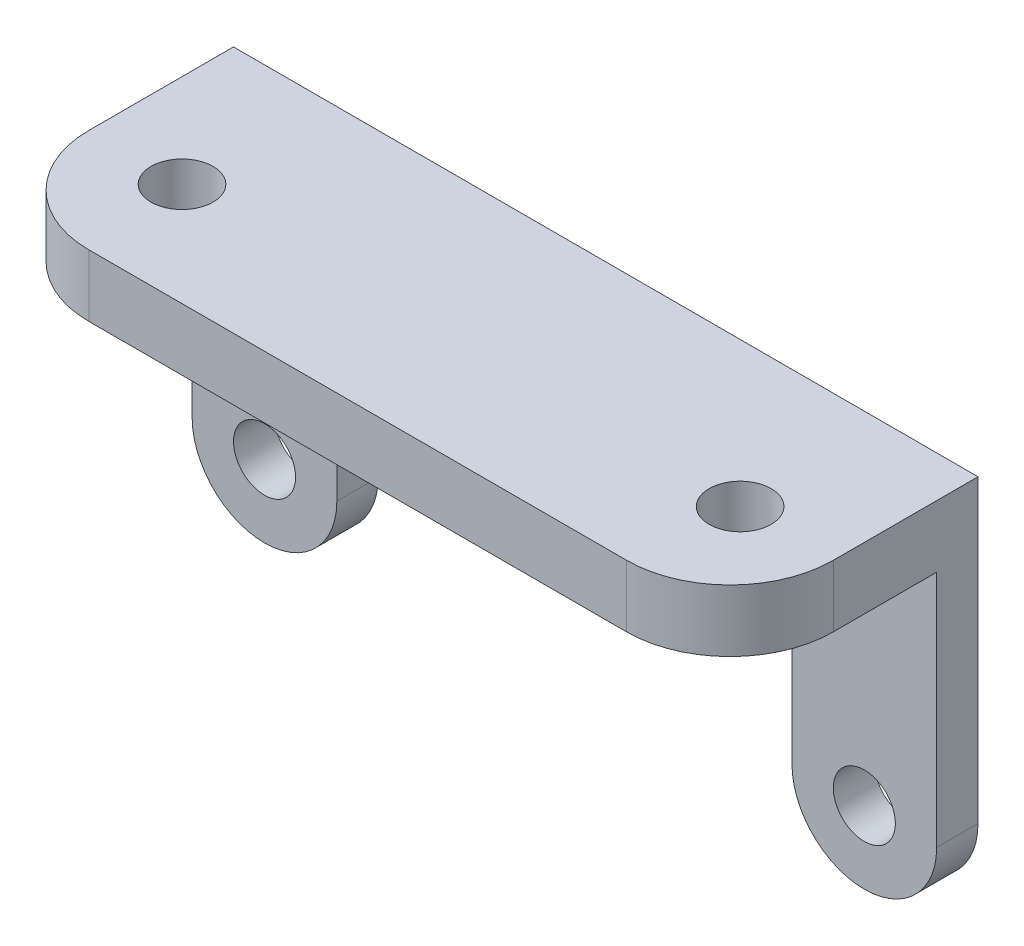
ISO-10303-21;
HEADER;
FILE_DESCRIPTION(('STEP AP214'),'2;1');
FILE_NAME('part.step','',(''),(''),'','','');
FILE_SCHEMA(('AUTOMOTIVE_DESIGN { 1 0 10303 214 1 1 1 1 }'));
ENDSEC;
DATA;
#1=APPLICATION_CONTEXT('core data for automotive mechanical design processes');
#2=APPLICATION_PROTOCOL_DEFINITION('international standard','automotive_design',2000,#1);
#3=PRODUCT_CONTEXT('',#1,'mechanical');
#4=PRODUCT('Part','Part','',(#3));
#5=PRODUCT_RELATED_PRODUCT_CATEGORY('part','',(#4));
#6=PRODUCT_DEFINITION_FORMATION('','',#4);
#7=PRODUCT_DEFINITION_CONTEXT('part definition',#1,'design');
#8=PRODUCT_DEFINITION('design','',#6,#7);
#9=PRODUCT_DEFINITION_SHAPE('','',#8);
#10=(LENGTH_UNIT() NAMED_UNIT(*) SI_UNIT(.MILLI.,.METRE.));
#11=(NAMED_UNIT(*) PLANE_ANGLE_UNIT() SI_UNIT($,.RADIAN.));
#12=(NAMED_UNIT(*) SI_UNIT($,.STERADIAN.) SOLID_ANGLE_UNIT());
#13=UNCERTAINTY_MEASURE_WITH_UNIT(LENGTH_MEASURE(1.E-05),#10,'distance_accuracy_value','');
#14=(GEOMETRIC_REPRESENTATION_CONTEXT(3) GLOBAL_UNCERTAINTY_ASSIGNED_CONTEXT((#13)) GLOBAL_UNIT_ASSIGNED_CONTEXT((#10,
#11,#12)) REPRESENTATION_CONTEXT('',''));
#15=CARTESIAN_POINT('',(0.,0.,0.));
#16=DIRECTION('',(0.,0.,1.));
#17=DIRECTION('',(1.,0.,0.));
#18=AXIS2_PLACEMENT_3D('',#15,#16,#17);
#19=CARTESIAN_POINT('',(-14.5085,-12.0321268610724,2.));
#20=DIRECTION('',(0.,0.,1.));
#21=DIRECTION('',(1.,0.,0.));
#22=AXIS2_PLACEMENT_3D('',#19,#20,#21);
#23=PLANE('',#22);
#24=DIRECTION('',(1.,0.,0.));
#25=VECTOR('',#24,1.);
#26=CARTESIAN_POINT('',(-18.0085,-0.499999999999994,2.));
#27=LINE('',#26,#25);
#28=CARTESIAN_POINT('',(-18.0085,-0.499999999999995,2.));
#29=VERTEX_POINT('',#28);
#30=CARTESIAN_POINT('',(18.0085,-0.499999999999995,2.));
#31=VERTEX_POINT('',#30);
#32=EDGE_CURVE('E141',#29,#31,#27,.T.);
#33=ORIENTED_EDGE('',*,*,#32,.F.);
#34=DIRECTION('',(0.,-1.,0.));
#35=VECTOR('',#34,1.);
#36=CARTESIAN_POINT('',(-18.0085,2.50000000000001,2.));
#37=LINE('',#36,#35);
#38=CARTESIAN_POINT('',(-18.0085,-12.0321268610724,2.));
#39=VERTEX_POINT('',#38);
#40=EDGE_CURVE('E146',#29,#39,#37,.T.);
#41=ORIENTED_EDGE('',*,*,#40,.T.);
#42=CARTESIAN_POINT('',(-14.5085,-12.0321268610724,2.));
#43=DIRECTION('',(0.,0.,1.));
#44=DIRECTION('',(1.,0.,0.));
#45=AXIS2_PLACEMENT_3D('',#42,#43,#44);
#46=CIRCLE('',#45,3.49999999999999);
#47=CARTESIAN_POINT('',(-11.0085,-12.0321268610724,2.));
#48=VERTEX_POINT('',#47);
#49=EDGE_CURVE('E175',#39,#48,#46,.T.);
#50=ORIENTED_EDGE('',*,*,#49,.T.);
#51=DIRECTION('',(0.,1.,0.));
#52=VECTOR('',#51,1.);
#53=CARTESIAN_POINT('',(-11.0085,-3.59582648567477,2.));
#54=LINE('',#53,#52);
#55=CARTESIAN_POINT('',(-11.0085,-3.59582648567477,2.));
#56=VERTEX_POINT('',#55);
#57=EDGE_CURVE('E177',#48,#56,#54,.T.);
#58=ORIENTED_EDGE('',*,*,#57,.T.);
#59=DIRECTION('',(1.,0.,0.));
#60=VECTOR('',#59,1.);
#61=CARTESIAN_POINT('',(-11.0085,-3.59582648567477,2.));
#62=LINE('',#61,#60);
#63=CARTESIAN_POINT('',(11.0085,-3.59582648567477,2.));
#64=VERTEX_POINT('',#63);
#65=EDGE_CURVE('E179',#56,#64,#62,.T.);
#66=ORIENTED_EDGE('',*,*,#65,.T.);
#67=DIRECTION('',(0.,-1.,0.));
#68=VECTOR('',#67,1.);
#69=CARTESIAN_POINT('',(11.0085,-3.59582648567477,2.));
#70=LINE('',#69,#68);
#71=CARTESIAN_POINT('',(11.0085,-12.0321268610723,2.));
#72=VERTEX_POINT('',#71);
#73=EDGE_CURVE('E181',#64,#72,#70,.T.);
#74=ORIENTED_EDGE('',*,*,#73,.T.);
#75=CARTESIAN_POINT('',(14.5085,-12.0321268610724,2.));
#76=DIRECTION('',(0.,0.,1.));
#77=DIRECTION('',(-1.,0.,0.));
#78=AXIS2_PLACEMENT_3D('',#75,#76,#77);
#79=CIRCLE('',#78,3.49999999999999);
#80=CARTESIAN_POINT('',(18.0085,-12.0321268610723,2.));
#81=VERTEX_POINT('',#80);
#82=EDGE_CURVE('E144',#72,#81,#79,.T.);
#83=ORIENTED_EDGE('',*,*,#82,.T.);
#84=DIRECTION('',(0.,1.,0.));
#85=VECTOR('',#84,1.);
#86=CARTESIAN_POINT('',(18.0085,-12.0321268610723,2.));
#87=LINE('',#86,#85);
#88=EDGE_CURVE('E132',#81,#31,#87,.T.);
#89=ORIENTED_EDGE('',*,*,#88,.T.);
#90=EDGE_LOOP('',(#33,#41,#50,#58,#66,#74,#83,#89));
#91=FACE_BOUND('',#90,.T.);
#92=CARTESIAN_POINT('',(-14.5085,-12.0321268610724,2.));
#93=DIRECTION('',(0.,0.,1.));
#94=DIRECTION('',(1.,0.,0.));
#95=AXIS2_PLACEMENT_3D('',#92,#93,#94);
#96=CIRCLE('',#95,1.5);
#97=CARTESIAN_POINT('',(-13.0085,-12.0321268610724,2.));
#98=VERTEX_POINT('',#97);
#99=EDGE_CURVE('E168',#98,#98,#96,.T.);
#100=ORIENTED_EDGE('',*,*,#99,.F.);
#101=EDGE_LOOP('',(#100));
#102=FACE_BOUND('',#101,.T.);
#103=CARTESIAN_POINT('',(14.5085,-12.0321268610724,2.));
#104=DIRECTION('',(0.,0.,1.));
#105=DIRECTION('',(-1.,0.,0.));
#106=AXIS2_PLACEMENT_3D('',#103,#104,#105);
#107=CIRCLE('',#106,1.49999999999999);
#108=CARTESIAN_POINT('',(13.0085,-12.0321268610724,2.));
#109=VERTEX_POINT('',#108);
#110=EDGE_CURVE('E162',#109,#109,#107,.T.);
#111=ORIENTED_EDGE('',*,*,#110,.F.);
#112=EDGE_LOOP('',(#111));
#113=FACE_BOUND('',#112,.T.);
#114=ADVANCED_FACE('F41',(#91,#102,#113),#23,.T.);
#115=CARTESIAN_POINT('',(-14.5085,-12.0321268610724,0.));
#116=DIRECTION('',(0.,0.,1.));
#117=DIRECTION('',(1.,0.,0.));
#118=AXIS2_PLACEMENT_3D('',#115,#116,#117);
#119=PLANE('',#118);
#120=DIRECTION('',(0.,1.,0.));
#121=VECTOR('',#120,1.);
#122=CARTESIAN_POINT('',(18.0085,2.50000000000001,0.));
#123=LINE('',#122,#121);
#124=CARTESIAN_POINT('',(18.0085,-12.0321268610723,0.));
#125=VERTEX_POINT('',#124);
#126=CARTESIAN_POINT('',(18.0085,2.50000000000001,0.));
#127=VERTEX_POINT('',#126);
#128=EDGE_CURVE('E171',#125,#127,#123,.T.);
#129=ORIENTED_EDGE('',*,*,#128,.F.);
#130=CARTESIAN_POINT('',(14.5085,-12.0321268610724,0.));
#131=DIRECTION('',(0.,0.,1.));
#132=DIRECTION('',(-1.,0.,0.));
#133=AXIS2_PLACEMENT_3D('',#130,#131,#132);
#134=CIRCLE('',#133,3.49999999999999);
#135=CARTESIAN_POINT('',(11.0085,-12.0321268610723,0.));
#136=VERTEX_POINT('',#135);
#137=EDGE_CURVE('E147',#136,#125,#134,.T.);
#138=ORIENTED_EDGE('',*,*,#137,.F.);
#139=DIRECTION('',(0.,-1.,0.));
#140=VECTOR('',#139,1.);
#141=CARTESIAN_POINT('',(11.0085,-3.59582648567477,0.));
#142=LINE('',#141,#140);
#143=CARTESIAN_POINT('',(11.0085,-3.59582648567477,0.));
#144=VERTEX_POINT('',#143);
#145=EDGE_CURVE('E198',#144,#136,#142,.T.);
#146=ORIENTED_EDGE('',*,*,#145,.F.);
#147=DIRECTION('',(1.,0.,0.));
#148=VECTOR('',#147,1.);
#149=CARTESIAN_POINT('',(-11.0085,-3.59582648567477,0.));
#150=LINE('',#149,#148);
#151=CARTESIAN_POINT('',(-11.0085,-3.59582648567477,0.));
#152=VERTEX_POINT('',#151);
#153=EDGE_CURVE('E196',#152,#144,#150,.T.);
#154=ORIENTED_EDGE('',*,*,#153,.F.);
#155=DIRECTION('',(0.,1.,0.));
#156=VECTOR('',#155,1.);
#157=CARTESIAN_POINT('',(-11.0085,-3.59582648567477,0.));
#158=LINE('',#157,#156);
#159=CARTESIAN_POINT('',(-11.0085,-12.0321268610724,0.));
#160=VERTEX_POINT('',#159);
#161=EDGE_CURVE('E194',#160,#152,#158,.T.);
#162=ORIENTED_EDGE('',*,*,#161,.F.);
#163=CARTESIAN_POINT('',(-14.5085,-12.0321268610724,0.));
#164=DIRECTION('',(0.,0.,1.));
#165=DIRECTION('',(1.,0.,0.));
#166=AXIS2_PLACEMENT_3D('',#163,#164,#165);
#167=CIRCLE('',#166,3.49999999999999);
#168=CARTESIAN_POINT('',(-18.0085,-12.0321268610724,0.));
#169=VERTEX_POINT('',#168);
#170=EDGE_CURVE('E192',#169,#160,#167,.T.);
#171=ORIENTED_EDGE('',*,*,#170,.F.);
#172=DIRECTION('',(0.,-1.,0.));
#173=VECTOR('',#172,1.);
#174=CARTESIAN_POINT('',(-18.0085,-12.0321268610724,0.));
#175=LINE('',#174,#173);
#176=CARTESIAN_POINT('',(-18.0085,2.50000000000001,0.));
#177=VERTEX_POINT('',#176);
#178=EDGE_CURVE('E190',#177,#169,#175,.T.);
#179=ORIENTED_EDGE('',*,*,#178,.F.);
#180=DIRECTION('',(-1.,0.,0.));
#181=VECTOR('',#180,1.);
#182=CARTESIAN_POINT('',(-18.0085,2.50000000000001,0.));
#183=LINE('',#182,#181);
#184=EDGE_CURVE('E187',#127,#177,#183,.T.);
#185=ORIENTED_EDGE('',*,*,#184,.F.);
#186=EDGE_LOOP('',(#129,#138,#146,#154,#162,#171,#179,#185));
#187=FACE_BOUND('',#186,.T.);
#188=CARTESIAN_POINT('',(-14.5085,-12.0321268610724,0.));
#189=DIRECTION('',(0.,0.,1.));
#190=DIRECTION('',(1.,0.,0.));
#191=AXIS2_PLACEMENT_3D('',#188,#189,#190);
#192=CIRCLE('',#191,1.5);
#193=CARTESIAN_POINT('',(-13.0085,-12.0321268610724,0.));
#194=VERTEX_POINT('',#193);
#195=EDGE_CURVE('E165',#194,#194,#192,.T.);
#196=ORIENTED_EDGE('',*,*,#195,.T.);
#197=EDGE_LOOP('',(#196));
#198=FACE_BOUND('',#197,.T.);
#199=CARTESIAN_POINT('',(14.5085,-12.0321268610724,0.));
#200=DIRECTION('',(0.,0.,1.));
#201=DIRECTION('',(-1.,0.,0.));
#202=AXIS2_PLACEMENT_3D('',#199,#200,#201);
#203=CIRCLE('',#202,1.49999999999999);
#204=CARTESIAN_POINT('',(13.0085,-12.0321268610724,0.));
#205=VERTEX_POINT('',#204);
#206=EDGE_CURVE('E161',#205,#205,#203,.T.);
#207=ORIENTED_EDGE('',*,*,#206,.T.);
#208=EDGE_LOOP('',(#207));
#209=FACE_BOUND('',#208,.T.);
#210=ADVANCED_FACE('F250',(#187,#198,#209),#119,.F.);
#211=CARTESIAN_POINT('',(18.0085,2.50000000000001,2.));
#212=DIRECTION('',(-1.,0.,0.));
#213=DIRECTION('',(0.,-1.,0.));
#214=AXIS2_PLACEMENT_3D('',#211,#212,#213);
#215=PLANE('',#214);
#216=DIRECTION('',(0.,0.,-1.));
#217=VECTOR('',#216,1.);
#218=CARTESIAN_POINT('',(18.0085,2.50000000000001,2.));
#219=LINE('',#218,#217);
#220=CARTESIAN_POINT('',(18.0085,2.50000000000001,7.));
#221=VERTEX_POINT('',#220);
#222=EDGE_CURVE('E220',#221,#127,#219,.T.);
#223=ORIENTED_EDGE('',*,*,#222,.F.);
#224=DIRECTION('',(0.,1.,0.));
#225=VECTOR('',#224,1.);
#226=CARTESIAN_POINT('',(18.0085,-0.499999999999995,7.));
#227=LINE('',#226,#225);
#228=CARTESIAN_POINT('',(18.0085,-0.499999999999995,7.));
#229=VERTEX_POINT('',#228);
#230=EDGE_CURVE('E64',#221,#229,#227,.F.);
#231=ORIENTED_EDGE('',*,*,#230,.T.);
#232=DIRECTION('',(0.,0.,-1.));
#233=VECTOR('',#232,1.);
#234=CARTESIAN_POINT('',(18.0085,-0.499999999999995,12.));
#235=LINE('',#234,#233);
#236=EDGE_CURVE('E128',#229,#31,#235,.T.);
#237=ORIENTED_EDGE('',*,*,#236,.T.);
#238=ORIENTED_EDGE('',*,*,#88,.F.);
#239=DIRECTION('',(0.,0.,-1.));
#240=VECTOR('',#239,1.);
#241=CARTESIAN_POINT('',(18.0085,-12.0321268610723,2.));
#242=LINE('',#241,#240);
#243=EDGE_CURVE('E184',#81,#125,#242,.T.);
#244=ORIENTED_EDGE('',*,*,#243,.T.);
#245=ORIENTED_EDGE('',*,*,#128,.T.);
#246=EDGE_LOOP('',(#223,#231,#237,#238,#244,#245));
#247=FACE_BOUND('',#246,.T.);
#248=ADVANCED_FACE('F130',(#247),#215,.F.);
#249=CARTESIAN_POINT('',(-18.0085,2.50000000000001,2.));
#250=DIRECTION('',(0.,-1.,0.));
#251=DIRECTION('',(1.,0.,0.));
#252=AXIS2_PLACEMENT_3D('',#249,#250,#251);
#253=PLANE('',#252);
#254=CARTESIAN_POINT('',(-13.5,2.50000000000001,7.));
#255=DIRECTION('',(0.,1.,0.));
#256=DIRECTION('',(-1.,0.,0.));
#257=AXIS2_PLACEMENT_3D('',#254,#255,#256);
#258=CIRCLE('',#257,1.5);
#259=CARTESIAN_POINT('',(-15.,2.50000000000001,7.));
#260=VERTEX_POINT('',#259);
#261=EDGE_CURVE('E224',#260,#260,#258,.T.);
#262=ORIENTED_EDGE('',*,*,#261,.F.);
#263=EDGE_LOOP('',(#262));
#264=FACE_BOUND('',#263,.T.);
#265=CARTESIAN_POINT('',(13.5,2.50000000000001,7.));
#266=DIRECTION('',(0.,1.,0.));
#267=DIRECTION('',(1.,0.,0.));
#268=AXIS2_PLACEMENT_3D('',#265,#266,#267);
#269=CIRCLE('',#268,1.5);
#270=CARTESIAN_POINT('',(15.,2.50000000000001,7.));
#271=VERTEX_POINT('',#270);
#272=EDGE_CURVE('E326',#271,#271,#269,.T.);
#273=ORIENTED_EDGE('',*,*,#272,.F.);
#274=EDGE_LOOP('',(#273));
#275=FACE_BOUND('',#274,.T.);
#276=DIRECTION('',(-1.,0.,0.));
#277=VECTOR('',#276,1.);
#278=CARTESIAN_POINT('',(-18.0085,2.50000000000001,12.));
#279=LINE('',#278,#277);
#280=CARTESIAN_POINT('',(13.0085,2.50000000000001,12.));
#281=VERTEX_POINT('',#280);
#282=CARTESIAN_POINT('',(-13.0085,2.50000000000001,12.));
#283=VERTEX_POINT('',#282);
#284=EDGE_CURVE('E136',#281,#283,#279,.T.);
#285=ORIENTED_EDGE('',*,*,#284,.F.);
#286=CARTESIAN_POINT('',(13.0085,2.50000000000001,7.));
#287=DIRECTION('',(0.,-1.,0.));
#288=DIRECTION('',(1.,0.,0.));
#289=AXIS2_PLACEMENT_3D('',#286,#287,#288);
#290=CIRCLE('',#289,5.);
#291=EDGE_CURVE('E233',#281,#221,#290,.F.);
#292=ORIENTED_EDGE('',*,*,#291,.T.);
#293=ORIENTED_EDGE('',*,*,#222,.T.);
#294=ORIENTED_EDGE('',*,*,#184,.T.);
#295=DIRECTION('',(0.,0.,-1.));
#296=VECTOR('',#295,1.);
#297=CARTESIAN_POINT('',(-18.0085,2.50000000000001,2.));
#298=LINE('',#297,#296);
#299=CARTESIAN_POINT('',(-18.0085,2.50000000000001,7.));
#300=VERTEX_POINT('',#299);
#301=EDGE_CURVE('E218',#300,#177,#298,.T.);
#302=ORIENTED_EDGE('',*,*,#301,.F.);
#303=CARTESIAN_POINT('',(-13.0085,2.50000000000001,7.));
#304=DIRECTION('',(0.,-1.,0.));
#305=DIRECTION('',(1.,0.,0.));
#306=AXIS2_PLACEMENT_3D('',#303,#304,#305);
#307=CIRCLE('',#306,5.);
#308=EDGE_CURVE('E231',#300,#283,#307,.F.);
#309=ORIENTED_EDGE('',*,*,#308,.T.);
#310=EDGE_LOOP('',(#285,#292,#293,#294,#302,#309));
#311=FACE_BOUND('',#310,.T.);
#312=ADVANCED_FACE('F245',(#264,#275,#311),#253,.F.);
#313=CARTESIAN_POINT('',(-18.0085,-12.0321268610724,2.));
#314=DIRECTION('',(1.,0.,0.));
#315=DIRECTION('',(0.,1.,0.));
#316=AXIS2_PLACEMENT_3D('',#313,#314,#315);
#317=PLANE('',#316);
#318=DIRECTION('',(0.,0.,-1.));
#319=VECTOR('',#318,1.);
#320=CARTESIAN_POINT('',(-18.0085,-0.499999999999994,12.));
#321=LINE('',#320,#319);
#322=CARTESIAN_POINT('',(-18.0085,-0.499999999999994,7.));
#323=VERTEX_POINT('',#322);
#324=EDGE_CURVE('E135',#323,#29,#321,.T.);
#325=ORIENTED_EDGE('',*,*,#324,.F.);
#326=DIRECTION('',(0.,-1.,0.));
#327=VECTOR('',#326,1.);
#328=CARTESIAN_POINT('',(-18.0085,2.50000000000001,7.));
#329=LINE('',#328,#327);
#330=EDGE_CURVE('E11',#323,#300,#329,.F.);
#331=ORIENTED_EDGE('',*,*,#330,.T.);
#332=ORIENTED_EDGE('',*,*,#301,.T.);
#333=ORIENTED_EDGE('',*,*,#178,.T.);
#334=DIRECTION('',(0.,0.,-1.));
#335=VECTOR('',#334,1.);
#336=CARTESIAN_POINT('',(-18.0085,-12.0321268610724,2.));
#337=LINE('',#336,#335);
#338=EDGE_CURVE('E215',#39,#169,#337,.T.);
#339=ORIENTED_EDGE('',*,*,#338,.F.);
#340=ORIENTED_EDGE('',*,*,#40,.F.);
#341=EDGE_LOOP('',(#325,#331,#332,#333,#339,#340));
#342=FACE_BOUND('',#341,.T.);
#343=ADVANCED_FACE('F258',(#342),#317,.F.);
#344=CARTESIAN_POINT('',(-14.5085,-12.0321268610724,2.));
#345=DIRECTION('',(0.,0.,-1.));
#346=DIRECTION('',(-1.,0.,0.));
#347=AXIS2_PLACEMENT_3D('',#344,#345,#346);
#348=CYLINDRICAL_SURFACE('',#347,3.49999999999999);
#349=ORIENTED_EDGE('',*,*,#170,.T.);
#350=DIRECTION('',(0.,0.,-1.));
#351=VECTOR('',#350,1.);
#352=CARTESIAN_POINT('',(-11.0085,-12.0321268610724,2.));
#353=LINE('',#352,#351);
#354=EDGE_CURVE('E212',#48,#160,#353,.T.);
#355=ORIENTED_EDGE('',*,*,#354,.F.);
#356=ORIENTED_EDGE('',*,*,#49,.F.);
#357=ORIENTED_EDGE('',*,*,#338,.T.);
#358=EDGE_LOOP('',(#349,#355,#356,#357));
#359=FACE_BOUND('',#358,.T.);
#360=ADVANCED_FACE('F265',(#359),#348,.T.);
#361=CARTESIAN_POINT('',(-11.0085,-3.59582648567477,2.));
#362=DIRECTION('',(-1.,0.,0.));
#363=DIRECTION('',(0.,-1.,0.));
#364=AXIS2_PLACEMENT_3D('',#361,#362,#363);
#365=PLANE('',#364);
#366=ORIENTED_EDGE('',*,*,#161,.T.);
#367=DIRECTION('',(0.,0.,-1.));
#368=VECTOR('',#367,1.);
#369=CARTESIAN_POINT('',(-11.0085,-3.59582648567477,2.));
#370=LINE('',#369,#368);
#371=EDGE_CURVE('E209',#56,#152,#370,.T.);
#372=ORIENTED_EDGE('',*,*,#371,.F.);
#373=ORIENTED_EDGE('',*,*,#57,.F.);
#374=ORIENTED_EDGE('',*,*,#354,.T.);
#375=EDGE_LOOP('',(#366,#372,#373,#374));
#376=FACE_BOUND('',#375,.T.);
#377=ADVANCED_FACE('F268',(#376),#365,.F.);
#378=CARTESIAN_POINT('',(-11.0085,-3.59582648567477,2.));
#379=DIRECTION('',(0.,1.,0.));
#380=DIRECTION('',(-1.,0.,0.));
#381=AXIS2_PLACEMENT_3D('',#378,#379,#380);
#382=PLANE('',#381);
#383=ORIENTED_EDGE('',*,*,#153,.T.);
#384=DIRECTION('',(0.,0.,-1.));
#385=VECTOR('',#384,1.);
#386=CARTESIAN_POINT('',(11.0085,-3.59582648567477,2.));
#387=LINE('',#386,#385);
#388=EDGE_CURVE('E206',#64,#144,#387,.T.);
#389=ORIENTED_EDGE('',*,*,#388,.F.);
#390=ORIENTED_EDGE('',*,*,#65,.F.);
#391=ORIENTED_EDGE('',*,*,#371,.T.);
#392=EDGE_LOOP('',(#383,#389,#390,#391));
#393=FACE_BOUND('',#392,.T.);
#394=ADVANCED_FACE('F273',(#393),#382,.F.);
#395=CARTESIAN_POINT('',(11.0085,-3.59582648567477,2.));
#396=DIRECTION('',(1.,0.,0.));
#397=DIRECTION('',(0.,1.,0.));
#398=AXIS2_PLACEMENT_3D('',#395,#396,#397);
#399=PLANE('',#398);
#400=ORIENTED_EDGE('',*,*,#145,.T.);
#401=DIRECTION('',(0.,0.,-1.));
#402=VECTOR('',#401,1.);
#403=CARTESIAN_POINT('',(11.0085,-12.0321268610723,2.));
#404=LINE('',#403,#402);
#405=EDGE_CURVE('E203',#72,#136,#404,.T.);
#406=ORIENTED_EDGE('',*,*,#405,.F.);
#407=ORIENTED_EDGE('',*,*,#73,.F.);
#408=ORIENTED_EDGE('',*,*,#388,.T.);
#409=EDGE_LOOP('',(#400,#406,#407,#408));
#410=FACE_BOUND('',#409,.T.);
#411=ADVANCED_FACE('F277',(#410),#399,.F.);
#412=CARTESIAN_POINT('',(14.5085,-12.0321268610724,2.));
#413=DIRECTION('',(0.,0.,-1.));
#414=DIRECTION('',(-1.,0.,0.));
#415=AXIS2_PLACEMENT_3D('',#412,#413,#414);
#416=CYLINDRICAL_SURFACE('',#415,3.49999999999999);
#417=ORIENTED_EDGE('',*,*,#137,.T.);
#418=ORIENTED_EDGE('',*,*,#243,.F.);
#419=ORIENTED_EDGE('',*,*,#82,.F.);
#420=ORIENTED_EDGE('',*,*,#405,.T.);
#421=EDGE_LOOP('',(#417,#418,#419,#420));
#422=FACE_BOUND('',#421,.T.);
#423=ADVANCED_FACE('F280',(#422),#416,.T.);
#424=CARTESIAN_POINT('',(-14.5085,-12.0321268610724,2.));
#425=DIRECTION('',(0.,0.,-1.));
#426=DIRECTION('',(-1.,0.,0.));
#427=AXIS2_PLACEMENT_3D('',#424,#425,#426);
#428=CYLINDRICAL_SURFACE('',#427,1.5);
#429=ORIENTED_EDGE('',*,*,#99,.T.);
#430=EDGE_LOOP('',(#429));
#431=FACE_BOUND('',#430,.T.);
#432=ORIENTED_EDGE('',*,*,#195,.F.);
#433=EDGE_LOOP('',(#432));
#434=FACE_BOUND('',#433,.T.);
#435=ADVANCED_FACE('F282',(#431,#434),#428,.F.);
#436=CARTESIAN_POINT('',(14.5085,-12.0321268610724,2.));
#437=DIRECTION('',(0.,0.,-1.));
#438=DIRECTION('',(-1.,0.,0.));
#439=AXIS2_PLACEMENT_3D('',#436,#437,#438);
#440=CYLINDRICAL_SURFACE('',#439,1.49999999999999);
#441=ORIENTED_EDGE('',*,*,#110,.T.);
#442=EDGE_LOOP('',(#441));
#443=FACE_BOUND('',#442,.T.);
#444=ORIENTED_EDGE('',*,*,#206,.F.);
#445=EDGE_LOOP('',(#444));
#446=FACE_BOUND('',#445,.T.);
#447=ADVANCED_FACE('F288',(#443,#446),#440,.F.);
#448=CARTESIAN_POINT('',(-18.0085,-0.499999999999994,12.));
#449=DIRECTION('',(0.,1.,0.));
#450=DIRECTION('',(-1.,0.,0.));
#451=AXIS2_PLACEMENT_3D('',#448,#449,#450);
#452=PLANE('',#451);
#453=CARTESIAN_POINT('',(-13.5,-0.499999999999994,7.));
#454=DIRECTION('',(0.,1.,0.));
#455=DIRECTION('',(-1.,0.,0.));
#456=AXIS2_PLACEMENT_3D('',#453,#454,#455);
#457=CIRCLE('',#456,1.5);
#458=CARTESIAN_POINT('',(-15.,-0.499999999999994,7.));
#459=VERTEX_POINT('',#458);
#460=EDGE_CURVE('E151',#459,#459,#457,.T.);
#461=ORIENTED_EDGE('',*,*,#460,.T.);
#462=EDGE_LOOP('',(#461));
#463=FACE_BOUND('',#462,.T.);
#464=CARTESIAN_POINT('',(13.5,-0.499999999999994,7.));
#465=DIRECTION('',(0.,1.,0.));
#466=DIRECTION('',(-1.,0.,0.));
#467=AXIS2_PLACEMENT_3D('',#464,#465,#466);
#468=CIRCLE('',#467,1.5);
#469=CARTESIAN_POINT('',(12.,-0.499999999999994,7.));
#470=VERTEX_POINT('',#469);
#471=EDGE_CURVE('E156',#470,#470,#468,.T.);
#472=ORIENTED_EDGE('',*,*,#471,.T.);
#473=EDGE_LOOP('',(#472));
#474=FACE_BOUND('',#473,.T.);
#475=ORIENTED_EDGE('',*,*,#236,.F.);
#476=CARTESIAN_POINT('',(13.0085,-0.499999999999995,7.));
#477=DIRECTION('',(0.,1.,0.));
#478=DIRECTION('',(-1.,0.,0.));
#479=AXIS2_PLACEMENT_3D('',#476,#477,#478);
#480=CIRCLE('',#479,5.);
#481=CARTESIAN_POINT('',(13.0085,-0.499999999999995,12.));
#482=VERTEX_POINT('',#481);
#483=EDGE_CURVE('E49',#229,#482,#480,.F.);
#484=ORIENTED_EDGE('',*,*,#483,.T.);
#485=DIRECTION('',(1.,0.,0.));
#486=VECTOR('',#485,1.);
#487=CARTESIAN_POINT('',(-18.0085,-0.499999999999994,12.));
#488=LINE('',#487,#486);
#489=CARTESIAN_POINT('',(-13.0085,-0.499999999999995,12.));
#490=VERTEX_POINT('',#489);
#491=EDGE_CURVE('E150',#490,#482,#488,.T.);
#492=ORIENTED_EDGE('',*,*,#491,.F.);
#493=CARTESIAN_POINT('',(-13.0085,-0.499999999999995,7.));
#494=DIRECTION('',(0.,1.,0.));
#495=DIRECTION('',(-1.,0.,0.));
#496=AXIS2_PLACEMENT_3D('',#493,#494,#495);
#497=CIRCLE('',#496,5.);
#498=EDGE_CURVE('E56',#490,#323,#497,.F.);
#499=ORIENTED_EDGE('',*,*,#498,.T.);
#500=ORIENTED_EDGE('',*,*,#324,.T.);
#501=ORIENTED_EDGE('',*,*,#32,.T.);
#502=EDGE_LOOP('',(#475,#484,#492,#499,#500,#501));
#503=FACE_BOUND('',#502,.T.);
#504=ADVANCED_FACE('F149',(#463,#474,#503),#452,.F.);
#505=CARTESIAN_POINT('',(0.,0.,12.));
#506=DIRECTION('',(0.,0.,1.));
#507=DIRECTION('',(1.,0.,0.));
#508=AXIS2_PLACEMENT_3D('',#505,#506,#507);
#509=PLANE('',#508);
#510=ORIENTED_EDGE('',*,*,#491,.T.);
#511=DIRECTION('',(0.,1.,0.));
#512=VECTOR('',#511,1.);
#513=CARTESIAN_POINT('',(13.0085,2.5,12.));
#514=LINE('',#513,#512);
#515=EDGE_CURVE('E228',#482,#281,#514,.T.);
#516=ORIENTED_EDGE('',*,*,#515,.T.);
#517=ORIENTED_EDGE('',*,*,#284,.T.);
#518=DIRECTION('',(0.,-1.,0.));
#519=VECTOR('',#518,1.);
#520=CARTESIAN_POINT('',(-13.0085,-0.499999999999993,12.));
#521=LINE('',#520,#519);
#522=EDGE_CURVE('E222',#283,#490,#521,.T.);
#523=ORIENTED_EDGE('',*,*,#522,.T.);
#524=EDGE_LOOP('',(#510,#516,#517,#523));
#525=FACE_BOUND('',#524,.T.);
#526=ADVANCED_FACE('F239',(#525),#509,.T.);
#527=CARTESIAN_POINT('',(13.5,-15.5321268610723,7.));
#528=DIRECTION('',(0.,1.,0.));
#529=DIRECTION('',(-1.,0.,0.));
#530=AXIS2_PLACEMENT_3D('',#527,#528,#529);
#531=CYLINDRICAL_SURFACE('',#530,1.5);
#532=ORIENTED_EDGE('',*,*,#272,.T.);
#533=EDGE_LOOP('',(#532));
#534=FACE_BOUND('',#533,.T.);
#535=ORIENTED_EDGE('',*,*,#471,.F.);
#536=EDGE_LOOP('',(#535));
#537=FACE_BOUND('',#536,.T.);
#538=ADVANCED_FACE('F308',(#534,#537),#531,.F.);
#539=CARTESIAN_POINT('',(-13.5,-15.5321268610724,7.));
#540=DIRECTION('',(0.,1.,0.));
#541=DIRECTION('',(-1.,0.,0.));
#542=AXIS2_PLACEMENT_3D('',#539,#540,#541);
#543=CYLINDRICAL_SURFACE('',#542,1.5);
#544=ORIENTED_EDGE('',*,*,#261,.T.);
#545=EDGE_LOOP('',(#544));
#546=FACE_BOUND('',#545,.T.);
#547=ORIENTED_EDGE('',*,*,#460,.F.);
#548=EDGE_LOOP('',(#547));
#549=FACE_BOUND('',#548,.T.);
#550=ADVANCED_FACE('F310',(#546,#549),#543,.F.);
#551=CARTESIAN_POINT('',(13.0085,0.,7.));
#552=DIRECTION('',(0.,-1.,0.));
#553=DIRECTION('',(1.,0.,0.));
#554=AXIS2_PLACEMENT_3D('',#551,#552,#553);
#555=CYLINDRICAL_SURFACE('',#554,5.);
#556=ORIENTED_EDGE('',*,*,#483,.F.);
#557=ORIENTED_EDGE('',*,*,#230,.F.);
#558=ORIENTED_EDGE('',*,*,#291,.F.);
#559=ORIENTED_EDGE('',*,*,#515,.F.);
#560=EDGE_LOOP('',(#556,#557,#558,#559));
#561=FACE_BOUND('',#560,.T.);
#562=ADVANCED_FACE('F243',(#561),#555,.T.);
#563=CARTESIAN_POINT('',(-13.0085,0.,7.));
#564=DIRECTION('',(0.,1.,0.));
#565=DIRECTION('',(-1.,0.,0.));
#566=AXIS2_PLACEMENT_3D('',#563,#564,#565);
#567=CYLINDRICAL_SURFACE('',#566,5.);
#568=ORIENTED_EDGE('',*,*,#308,.F.);
#569=ORIENTED_EDGE('',*,*,#330,.F.);
#570=ORIENTED_EDGE('',*,*,#498,.F.);
#571=ORIENTED_EDGE('',*,*,#522,.F.);
#572=EDGE_LOOP('',(#568,#569,#570,#571));
#573=FACE_BOUND('',#572,.T.);
#574=ADVANCED_FACE('F43',(#573),#567,.T.);
#575=CLOSED_SHELL('',(#114,#210,#248,#312,#343,#360,#377,#394,#411,#423,#435,#447,#504,#526,
#538,#550,#562,#574));
#576=MANIFOLD_SOLID_BREP('B2',#575);
#577=ADVANCED_BREP_SHAPE_REPRESENTATION('',(#18,#576),#14);
#578=SHAPE_DEFINITION_REPRESENTATION(#9,#577);
ENDSEC;
END-ISO-10303-21;
